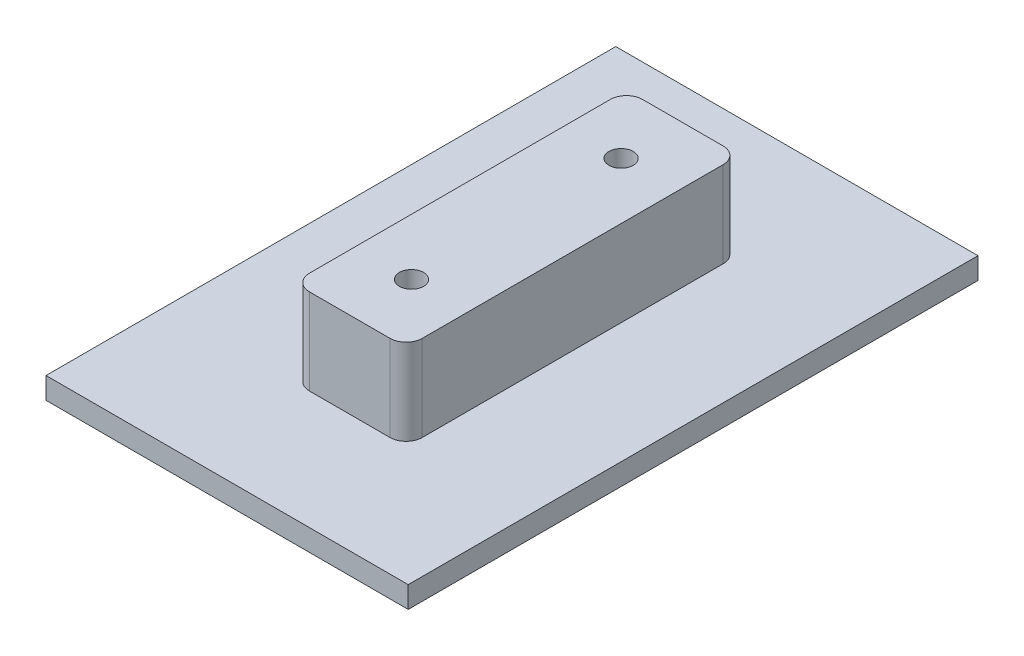
ISO-10303-21;
HEADER;
FILE_DESCRIPTION(('STEP AP214'),'2;1');
FILE_NAME('part.step','',(''),(''),'','','');
FILE_SCHEMA(('AUTOMOTIVE_DESIGN { 1 0 10303 214 1 1 1 1 }'));
ENDSEC;
DATA;
#1=APPLICATION_CONTEXT('core data for automotive mechanical design processes');
#2=APPLICATION_PROTOCOL_DEFINITION('international standard','automotive_design',2000,#1);
#3=PRODUCT_CONTEXT('',#1,'mechanical');
#4=PRODUCT('Part','Part','',(#3));
#5=PRODUCT_RELATED_PRODUCT_CATEGORY('part','',(#4));
#6=PRODUCT_DEFINITION_FORMATION('','',#4);
#7=PRODUCT_DEFINITION_CONTEXT('part definition',#1,'design');
#8=PRODUCT_DEFINITION('design','',#6,#7);
#9=PRODUCT_DEFINITION_SHAPE('','',#8);
#10=(LENGTH_UNIT() NAMED_UNIT(*) SI_UNIT(.MILLI.,.METRE.));
#11=(NAMED_UNIT(*) PLANE_ANGLE_UNIT() SI_UNIT($,.RADIAN.));
#12=(NAMED_UNIT(*) SI_UNIT($,.STERADIAN.) SOLID_ANGLE_UNIT());
#13=UNCERTAINTY_MEASURE_WITH_UNIT(LENGTH_MEASURE(1.E-05),#10,'distance_accuracy_value','');
#14=(GEOMETRIC_REPRESENTATION_CONTEXT(3) GLOBAL_UNCERTAINTY_ASSIGNED_CONTEXT((#13)) GLOBAL_UNIT_ASSIGNED_CONTEXT((#10,
#11,#12)) REPRESENTATION_CONTEXT('',''));
#15=CARTESIAN_POINT('',(0.,0.,0.));
#16=DIRECTION('',(0.,0.,1.));
#17=DIRECTION('',(1.,0.,0.));
#18=AXIS2_PLACEMENT_3D('',#15,#16,#17);
#19=CARTESIAN_POINT('',(-107.000738470902,0.,168.319923824924));
#20=DIRECTION('',(0.,1.,0.));
#21=DIRECTION('',(0.,0.,1.));
#22=AXIS2_PLACEMENT_3D('',#19,#20,#21);
#23=PLANE('',#22);
#24=DIRECTION('',(0.,0.,1.));
#25=VECTOR('',#24,1.);
#26=CARTESIAN_POINT('',(-107.000738470902,0.,-168.319923824925));
#27=LINE('',#26,#25);
#28=CARTESIAN_POINT('',(-107.000738470902,0.,-168.319923824925));
#29=VERTEX_POINT('',#28);
#30=CARTESIAN_POINT('',(-107.000738470902,0.,168.319923824924));
#31=VERTEX_POINT('',#30);
#32=EDGE_CURVE('E210',#29,#31,#27,.T.);
#33=ORIENTED_EDGE('',*,*,#32,.T.);
#34=DIRECTION('',(1.,0.,0.));
#35=VECTOR('',#34,1.);
#36=CARTESIAN_POINT('',(-107.000738470902,0.,168.319923824924));
#37=LINE('',#36,#35);
#38=CARTESIAN_POINT('',(107.000738470902,0.,168.319923824924));
#39=VERTEX_POINT('',#38);
#40=EDGE_CURVE('E225',#31,#39,#37,.T.);
#41=ORIENTED_EDGE('',*,*,#40,.T.);
#42=DIRECTION('',(0.,0.,-1.));
#43=VECTOR('',#42,1.);
#44=CARTESIAN_POINT('',(107.000738470901,0.,-168.319923824925));
#45=LINE('',#44,#43);
#46=CARTESIAN_POINT('',(107.000738470901,0.,-168.319923824925));
#47=VERTEX_POINT('',#46);
#48=EDGE_CURVE('E228',#39,#47,#45,.T.);
#49=ORIENTED_EDGE('',*,*,#48,.T.);
#50=DIRECTION('',(-1.,0.,0.));
#51=VECTOR('',#50,1.);
#52=CARTESIAN_POINT('',(-107.000738470902,0.,-168.319923824925));
#53=LINE('',#52,#51);
#54=EDGE_CURVE('E216',#47,#29,#53,.T.);
#55=ORIENTED_EDGE('',*,*,#54,.T.);
#56=EDGE_LOOP('',(#33,#41,#49,#55));
#57=FACE_BOUND('',#56,.T.);
#58=CARTESIAN_POINT('',(26.3482710557629,0.,88.9));
#59=DIRECTION('',(0.,1.,0.));
#60=DIRECTION('',(0.,0.,1.));
#61=AXIS2_PLACEMENT_3D('',#58,#59,#60);
#62=CIRCLE('',#61,9.52499999999999);
#63=CARTESIAN_POINT('',(26.3482710557629,0.,98.425));
#64=VERTEX_POINT('',#63);
#65=CARTESIAN_POINT('',(35.8732710557629,0.,88.9));
#66=VERTEX_POINT('',#65);
#67=EDGE_CURVE('E153',#64,#66,#62,.T.);
#68=ORIENTED_EDGE('',*,*,#67,.F.);
#69=DIRECTION('',(1.,0.,0.));
#70=VECTOR('',#69,1.);
#71=CARTESIAN_POINT('',(-21.2767289442371,0.,98.425));
#72=LINE('',#71,#70);
#73=CARTESIAN_POINT('',(-21.2767289442371,0.,98.425));
#74=VERTEX_POINT('',#73);
#75=EDGE_CURVE('E54',#74,#64,#72,.T.);
#76=ORIENTED_EDGE('',*,*,#75,.F.);
#77=CARTESIAN_POINT('',(-21.2767289442371,0.,88.9));
#78=DIRECTION('',(0.,1.,0.));
#79=DIRECTION('',(0.,0.,1.));
#80=AXIS2_PLACEMENT_3D('',#77,#78,#79);
#81=CIRCLE('',#80,9.525);
#82=CARTESIAN_POINT('',(-30.8017289442371,0.,88.9));
#83=VERTEX_POINT('',#82);
#84=EDGE_CURVE('E194',#83,#74,#81,.T.);
#85=ORIENTED_EDGE('',*,*,#84,.F.);
#86=DIRECTION('',(0.,0.,1.));
#87=VECTOR('',#86,1.);
#88=CARTESIAN_POINT('',(-30.8017289442371,0.,-88.9));
#89=LINE('',#88,#87);
#90=CARTESIAN_POINT('',(-30.8017289442371,0.,-88.9));
#91=VERTEX_POINT('',#90);
#92=EDGE_CURVE('E191',#91,#83,#89,.T.);
#93=ORIENTED_EDGE('',*,*,#92,.F.);
#94=CARTESIAN_POINT('',(-21.2767289442371,0.,-88.9));
#95=DIRECTION('',(0.,1.,0.));
#96=DIRECTION('',(0.,0.,1.));
#97=AXIS2_PLACEMENT_3D('',#94,#95,#96);
#98=CIRCLE('',#97,9.525);
#99=CARTESIAN_POINT('',(-21.2767289442371,0.,-98.425));
#100=VERTEX_POINT('',#99);
#101=EDGE_CURVE('E188',#100,#91,#98,.T.);
#102=ORIENTED_EDGE('',*,*,#101,.F.);
#103=DIRECTION('',(-1.,0.,0.));
#104=VECTOR('',#103,1.);
#105=CARTESIAN_POINT('',(26.3482710557629,0.,-98.425));
#106=LINE('',#105,#104);
#107=CARTESIAN_POINT('',(26.3482710557629,0.,-98.425));
#108=VERTEX_POINT('',#107);
#109=EDGE_CURVE('E185',#108,#100,#106,.T.);
#110=ORIENTED_EDGE('',*,*,#109,.F.);
#111=CARTESIAN_POINT('',(26.3482710557629,0.,-88.9));
#112=DIRECTION('',(0.,1.,0.));
#113=DIRECTION('',(0.,0.,1.));
#114=AXIS2_PLACEMENT_3D('',#111,#112,#113);
#115=CIRCLE('',#114,9.525);
#116=CARTESIAN_POINT('',(35.8732710557629,0.,-88.9));
#117=VERTEX_POINT('',#116);
#118=EDGE_CURVE('E182',#117,#108,#115,.T.);
#119=ORIENTED_EDGE('',*,*,#118,.F.);
#120=DIRECTION('',(0.,0.,-1.));
#121=VECTOR('',#120,1.);
#122=CARTESIAN_POINT('',(35.8732710557629,0.,88.9));
#123=LINE('',#122,#121);
#124=EDGE_CURVE('E179',#66,#117,#123,.T.);
#125=ORIENTED_EDGE('',*,*,#124,.F.);
#126=EDGE_LOOP('',(#68,#76,#85,#93,#102,#110,#119,#125));
#127=FACE_BOUND('',#126,.T.);
#128=ADVANCED_FACE('F39',(#57,#127),#23,.T.);
#129=CARTESIAN_POINT('',(-107.000738470902,-12.7,-168.319923824925));
#130=DIRECTION('',(-1.,0.,0.));
#131=DIRECTION('',(0.,0.,1.));
#132=AXIS2_PLACEMENT_3D('',#129,#130,#131);
#133=PLANE('',#132);
#134=ORIENTED_EDGE('',*,*,#32,.F.);
#135=DIRECTION('',(0.,1.,0.));
#136=VECTOR('',#135,1.);
#137=CARTESIAN_POINT('',(-107.000738470902,-12.7,-168.319923824925));
#138=LINE('',#137,#136);
#139=CARTESIAN_POINT('',(-107.000738470902,-12.7,-168.319923824925));
#140=VERTEX_POINT('',#139);
#141=EDGE_CURVE('E63',#140,#29,#138,.T.);
#142=ORIENTED_EDGE('',*,*,#141,.F.);
#143=DIRECTION('',(0.,0.,1.));
#144=VECTOR('',#143,1.);
#145=CARTESIAN_POINT('',(-107.000738470902,-12.7,-168.319923824925));
#146=LINE('',#145,#144);
#147=CARTESIAN_POINT('',(-107.000738470902,-12.7,168.319923824924));
#148=VERTEX_POINT('',#147);
#149=EDGE_CURVE('E213',#140,#148,#146,.T.);
#150=ORIENTED_EDGE('',*,*,#149,.T.);
#151=DIRECTION('',(0.,1.,0.));
#152=VECTOR('',#151,1.);
#153=CARTESIAN_POINT('',(-107.000738470902,-12.7,168.319923824924));
#154=LINE('',#153,#152);
#155=EDGE_CURVE('E89',#148,#31,#154,.T.);
#156=ORIENTED_EDGE('',*,*,#155,.T.);
#157=EDGE_LOOP('',(#134,#142,#150,#156));
#158=FACE_BOUND('',#157,.T.);
#159=ADVANCED_FACE('F41',(#158),#133,.T.);
#160=CARTESIAN_POINT('',(-107.000738470902,-12.7,-168.319923824925));
#161=DIRECTION('',(0.,0.,-1.));
#162=DIRECTION('',(-1.,0.,0.));
#163=AXIS2_PLACEMENT_3D('',#160,#161,#162);
#164=PLANE('',#163);
#165=ORIENTED_EDGE('',*,*,#54,.F.);
#166=DIRECTION('',(0.,1.,0.));
#167=VECTOR('',#166,1.);
#168=CARTESIAN_POINT('',(107.000738470901,-12.7,-168.319923824925));
#169=LINE('',#168,#167);
#170=CARTESIAN_POINT('',(107.000738470901,-12.7,-168.319923824925));
#171=VERTEX_POINT('',#170);
#172=EDGE_CURVE('E234',#171,#47,#169,.T.);
#173=ORIENTED_EDGE('',*,*,#172,.F.);
#174=DIRECTION('',(-1.,0.,0.));
#175=VECTOR('',#174,1.);
#176=CARTESIAN_POINT('',(-107.000738470902,-12.7,-168.319923824925));
#177=LINE('',#176,#175);
#178=EDGE_CURVE('E221',#171,#140,#177,.T.);
#179=ORIENTED_EDGE('',*,*,#178,.T.);
#180=ORIENTED_EDGE('',*,*,#141,.T.);
#181=EDGE_LOOP('',(#165,#173,#179,#180));
#182=FACE_BOUND('',#181,.T.);
#183=ADVANCED_FACE('F262',(#182),#164,.T.);
#184=CARTESIAN_POINT('',(107.000738470901,-12.7,-168.319923824925));
#185=DIRECTION('',(1.,0.,0.));
#186=DIRECTION('',(0.,0.,-1.));
#187=AXIS2_PLACEMENT_3D('',#184,#185,#186);
#188=PLANE('',#187);
#189=ORIENTED_EDGE('',*,*,#48,.F.);
#190=DIRECTION('',(0.,1.,0.));
#191=VECTOR('',#190,1.);
#192=CARTESIAN_POINT('',(107.000738470902,-12.7,168.319923824924));
#193=LINE('',#192,#191);
#194=CARTESIAN_POINT('',(107.000738470902,-12.7,168.319923824924));
#195=VERTEX_POINT('',#194);
#196=EDGE_CURVE('E236',#195,#39,#193,.T.);
#197=ORIENTED_EDGE('',*,*,#196,.F.);
#198=DIRECTION('',(0.,0.,-1.));
#199=VECTOR('',#198,1.);
#200=CARTESIAN_POINT('',(107.000738470901,-12.7,-168.319923824925));
#201=LINE('',#200,#199);
#202=EDGE_CURVE('E218',#195,#171,#201,.T.);
#203=ORIENTED_EDGE('',*,*,#202,.T.);
#204=ORIENTED_EDGE('',*,*,#172,.T.);
#205=EDGE_LOOP('',(#189,#197,#203,#204));
#206=FACE_BOUND('',#205,.T.);
#207=ADVANCED_FACE('F316',(#206),#188,.T.);
#208=CARTESIAN_POINT('',(-107.000738470902,-12.7,168.319923824924));
#209=DIRECTION('',(0.,0.,1.));
#210=DIRECTION('',(1.,0.,0.));
#211=AXIS2_PLACEMENT_3D('',#208,#209,#210);
#212=PLANE('',#211);
#213=ORIENTED_EDGE('',*,*,#40,.F.);
#214=ORIENTED_EDGE('',*,*,#155,.F.);
#215=DIRECTION('',(1.,0.,0.));
#216=VECTOR('',#215,1.);
#217=CARTESIAN_POINT('',(-107.000738470902,-12.7,168.319923824924));
#218=LINE('',#217,#216);
#219=EDGE_CURVE('E215',#148,#195,#218,.T.);
#220=ORIENTED_EDGE('',*,*,#219,.T.);
#221=ORIENTED_EDGE('',*,*,#196,.T.);
#222=EDGE_LOOP('',(#213,#214,#220,#221));
#223=FACE_BOUND('',#222,.T.);
#224=ADVANCED_FACE('F309',(#223),#212,.T.);
#225=CARTESIAN_POINT('',(-107.000738470902,-12.7,168.319923824924));
#226=DIRECTION('',(0.,1.,0.));
#227=DIRECTION('',(0.,0.,1.));
#228=AXIS2_PLACEMENT_3D('',#225,#226,#227);
#229=PLANE('',#228);
#230=ORIENTED_EDGE('',*,*,#149,.F.);
#231=ORIENTED_EDGE('',*,*,#178,.F.);
#232=ORIENTED_EDGE('',*,*,#202,.F.);
#233=ORIENTED_EDGE('',*,*,#219,.F.);
#234=EDGE_LOOP('',(#230,#231,#232,#233));
#235=FACE_BOUND('',#234,.T.);
#236=ADVANCED_FACE('F307',(#235),#229,.F.);
#237=CARTESIAN_POINT('',(2.53577105576288,258.58000530516,61.9125));
#238=DIRECTION('',(0.,-1.,0.));
#239=DIRECTION('',(0.,0.,-1.));
#240=AXIS2_PLACEMENT_3D('',#237,#238,#239);
#241=CYLINDRICAL_SURFACE('',#240,7.14375);
#242=CARTESIAN_POINT('',(2.53577105576288,0.,61.9125));
#243=DIRECTION('',(0.,1.,0.));
#244=DIRECTION('',(0.,0.,1.));
#245=AXIS2_PLACEMENT_3D('',#242,#243,#244);
#246=CIRCLE('',#245,7.14375);
#247=CARTESIAN_POINT('',(2.53577105576288,0.,69.05625));
#248=VERTEX_POINT('',#247);
#249=EDGE_CURVE('E11',#248,#248,#246,.F.);
#250=ORIENTED_EDGE('',*,*,#249,.T.);
#251=EDGE_LOOP('',(#250));
#252=FACE_BOUND('',#251,.T.);
#253=CARTESIAN_POINT('',(2.53577105576288,50.7447866221852,61.9125));
#254=DIRECTION('',(0.,1.,0.));
#255=DIRECTION('',(0.,0.,1.));
#256=AXIS2_PLACEMENT_3D('',#253,#254,#255);
#257=CIRCLE('',#256,7.14375);
#258=CARTESIAN_POINT('',(2.53577105576288,50.7447866221852,69.05625));
#259=VERTEX_POINT('',#258);
#260=EDGE_CURVE('E159',#259,#259,#257,.T.);
#261=ORIENTED_EDGE('',*,*,#260,.T.);
#262=EDGE_LOOP('',(#261));
#263=FACE_BOUND('',#262,.T.);
#264=ADVANCED_FACE('F294',(#252,#263),#241,.F.);
#265=CARTESIAN_POINT('',(-21.2767289442371,258.58000530516,98.425));
#266=DIRECTION('',(0.,0.,-1.));
#267=DIRECTION('',(-1.,0.,0.));
#268=AXIS2_PLACEMENT_3D('',#265,#266,#267);
#269=PLANE('',#268);
#270=DIRECTION('',(1.,0.,0.));
#271=VECTOR('',#270,1.);
#272=CARTESIAN_POINT('',(-21.2767289442371,50.7447866221852,98.425));
#273=LINE('',#272,#271);
#274=CARTESIAN_POINT('',(-21.2767289442371,50.7447866221852,98.425));
#275=VERTEX_POINT('',#274);
#276=CARTESIAN_POINT('',(26.3482710557629,50.7447866221852,98.425));
#277=VERTEX_POINT('',#276);
#278=EDGE_CURVE('E139',#275,#277,#273,.T.);
#279=ORIENTED_EDGE('',*,*,#278,.F.);
#280=DIRECTION('',(0.,-1.,0.));
#281=VECTOR('',#280,1.);
#282=CARTESIAN_POINT('',(-21.2767289442371,258.58000530516,98.425));
#283=LINE('',#282,#281);
#284=EDGE_CURVE('E144',#275,#74,#283,.T.);
#285=ORIENTED_EDGE('',*,*,#284,.T.);
#286=ORIENTED_EDGE('',*,*,#75,.T.);
#287=DIRECTION('',(0.,-1.,0.));
#288=VECTOR('',#287,1.);
#289=CARTESIAN_POINT('',(26.3482710557629,258.58000530516,98.425));
#290=LINE('',#289,#288);
#291=EDGE_CURVE('E135',#277,#64,#290,.T.);
#292=ORIENTED_EDGE('',*,*,#291,.F.);
#293=EDGE_LOOP('',(#279,#285,#286,#292));
#294=FACE_BOUND('',#293,.T.);
#295=ADVANCED_FACE('F137',(#294),#269,.F.);
#296=CARTESIAN_POINT('',(-21.2767289442371,258.58000530516,88.9));
#297=DIRECTION('',(0.,-1.,0.));
#298=DIRECTION('',(0.,0.,-1.));
#299=AXIS2_PLACEMENT_3D('',#296,#297,#298);
#300=CYLINDRICAL_SURFACE('',#299,9.525);
#301=CARTESIAN_POINT('',(-21.2767289442371,50.7447866221852,88.9));
#302=DIRECTION('',(0.,1.,0.));
#303=DIRECTION('',(0.,0.,1.));
#304=AXIS2_PLACEMENT_3D('',#301,#302,#303);
#305=CIRCLE('',#304,9.525);
#306=CARTESIAN_POINT('',(-30.8017289442371,50.7447866221852,88.9));
#307=VERTEX_POINT('',#306);
#308=EDGE_CURVE('E158',#307,#275,#305,.T.);
#309=ORIENTED_EDGE('',*,*,#308,.F.);
#310=DIRECTION('',(0.,-1.,0.));
#311=VECTOR('',#310,1.);
#312=CARTESIAN_POINT('',(-30.8017289442371,258.58000530516,88.9));
#313=LINE('',#312,#311);
#314=EDGE_CURVE('E199',#307,#83,#313,.T.);
#315=ORIENTED_EDGE('',*,*,#314,.T.);
#316=ORIENTED_EDGE('',*,*,#84,.T.);
#317=ORIENTED_EDGE('',*,*,#284,.F.);
#318=EDGE_LOOP('',(#309,#315,#316,#317));
#319=FACE_BOUND('',#318,.T.);
#320=ADVANCED_FACE('F286',(#319),#300,.T.);
#321=CARTESIAN_POINT('',(-30.8017289442371,258.58000530516,-88.9));
#322=DIRECTION('',(1.,0.,0.));
#323=DIRECTION('',(0.,0.,-1.));
#324=AXIS2_PLACEMENT_3D('',#321,#322,#323);
#325=PLANE('',#324);
#326=DIRECTION('',(0.,0.,1.));
#327=VECTOR('',#326,1.);
#328=CARTESIAN_POINT('',(-30.8017289442371,50.7447866221852,-88.9));
#329=LINE('',#328,#327);
#330=CARTESIAN_POINT('',(-30.8017289442371,50.7447866221852,-88.9));
#331=VERTEX_POINT('',#330);
#332=EDGE_CURVE('E161',#331,#307,#329,.T.);
#333=ORIENTED_EDGE('',*,*,#332,.F.);
#334=DIRECTION('',(0.,-1.,0.));
#335=VECTOR('',#334,1.);
#336=CARTESIAN_POINT('',(-30.8017289442371,258.58000530516,-88.9));
#337=LINE('',#336,#335);
#338=EDGE_CURVE('E201',#331,#91,#337,.T.);
#339=ORIENTED_EDGE('',*,*,#338,.T.);
#340=ORIENTED_EDGE('',*,*,#92,.T.);
#341=ORIENTED_EDGE('',*,*,#314,.F.);
#342=EDGE_LOOP('',(#333,#339,#340,#341));
#343=FACE_BOUND('',#342,.T.);
#344=ADVANCED_FACE('F284',(#343),#325,.F.);
#345=CARTESIAN_POINT('',(-21.2767289442371,258.58000530516,-88.9));
#346=DIRECTION('',(0.,-1.,0.));
#347=DIRECTION('',(0.,0.,-1.));
#348=AXIS2_PLACEMENT_3D('',#345,#346,#347);
#349=CYLINDRICAL_SURFACE('',#348,9.525);
#350=CARTESIAN_POINT('',(-21.2767289442371,50.7447866221852,-88.9));
#351=DIRECTION('',(0.,1.,0.));
#352=DIRECTION('',(0.,0.,1.));
#353=AXIS2_PLACEMENT_3D('',#350,#351,#352);
#354=CIRCLE('',#353,9.525);
#355=CARTESIAN_POINT('',(-21.2767289442371,50.7447866221852,-98.425));
#356=VERTEX_POINT('',#355);
#357=EDGE_CURVE('E168',#356,#331,#354,.T.);
#358=ORIENTED_EDGE('',*,*,#357,.F.);
#359=DIRECTION('',(0.,-1.,0.));
#360=VECTOR('',#359,1.);
#361=CARTESIAN_POINT('',(-21.2767289442371,258.58000530516,-98.425));
#362=LINE('',#361,#360);
#363=EDGE_CURVE('E203',#356,#100,#362,.T.);
#364=ORIENTED_EDGE('',*,*,#363,.T.);
#365=ORIENTED_EDGE('',*,*,#101,.T.);
#366=ORIENTED_EDGE('',*,*,#338,.F.);
#367=EDGE_LOOP('',(#358,#364,#365,#366));
#368=FACE_BOUND('',#367,.T.);
#369=ADVANCED_FACE('F279',(#368),#349,.T.);
#370=CARTESIAN_POINT('',(26.3482710557629,258.58000530516,-98.425));
#371=DIRECTION('',(0.,0.,1.));
#372=DIRECTION('',(1.,0.,0.));
#373=AXIS2_PLACEMENT_3D('',#370,#371,#372);
#374=PLANE('',#373);
#375=DIRECTION('',(-1.,0.,0.));
#376=VECTOR('',#375,1.);
#377=CARTESIAN_POINT('',(26.3482710557629,50.7447866221852,-98.425));
#378=LINE('',#377,#376);
#379=CARTESIAN_POINT('',(26.3482710557629,50.7447866221852,-98.425));
#380=VERTEX_POINT('',#379);
#381=EDGE_CURVE('E171',#380,#356,#378,.T.);
#382=ORIENTED_EDGE('',*,*,#381,.F.);
#383=DIRECTION('',(0.,-1.,0.));
#384=VECTOR('',#383,1.);
#385=CARTESIAN_POINT('',(26.3482710557629,258.58000530516,-98.425));
#386=LINE('',#385,#384);
#387=EDGE_CURVE('E205',#380,#108,#386,.T.);
#388=ORIENTED_EDGE('',*,*,#387,.T.);
#389=ORIENTED_EDGE('',*,*,#109,.T.);
#390=ORIENTED_EDGE('',*,*,#363,.F.);
#391=EDGE_LOOP('',(#382,#388,#389,#390));
#392=FACE_BOUND('',#391,.T.);
#393=ADVANCED_FACE('F275',(#392),#374,.F.);
#394=CARTESIAN_POINT('',(26.3482710557629,258.58000530516,-88.9));
#395=DIRECTION('',(0.,-1.,0.));
#396=DIRECTION('',(0.,0.,-1.));
#397=AXIS2_PLACEMENT_3D('',#394,#395,#396);
#398=CYLINDRICAL_SURFACE('',#397,9.525);
#399=CARTESIAN_POINT('',(26.3482710557629,50.7447866221852,-88.9));
#400=DIRECTION('',(0.,1.,0.));
#401=DIRECTION('',(0.,0.,1.));
#402=AXIS2_PLACEMENT_3D('',#399,#400,#401);
#403=CIRCLE('',#402,9.525);
#404=CARTESIAN_POINT('',(35.8732710557629,50.7447866221852,-88.9));
#405=VERTEX_POINT('',#404);
#406=EDGE_CURVE('E174',#405,#380,#403,.T.);
#407=ORIENTED_EDGE('',*,*,#406,.F.);
#408=DIRECTION('',(0.,-1.,0.));
#409=VECTOR('',#408,1.);
#410=CARTESIAN_POINT('',(35.8732710557629,258.58000530516,-88.9));
#411=LINE('',#410,#409);
#412=EDGE_CURVE('E207',#405,#117,#411,.T.);
#413=ORIENTED_EDGE('',*,*,#412,.T.);
#414=ORIENTED_EDGE('',*,*,#118,.T.);
#415=ORIENTED_EDGE('',*,*,#387,.F.);
#416=EDGE_LOOP('',(#407,#413,#414,#415));
#417=FACE_BOUND('',#416,.T.);
#418=ADVANCED_FACE('F273',(#417),#398,.T.);
#419=CARTESIAN_POINT('',(35.8732710557629,258.58000530516,88.9));
#420=DIRECTION('',(-1.,0.,0.));
#421=DIRECTION('',(0.,0.,1.));
#422=AXIS2_PLACEMENT_3D('',#419,#420,#421);
#423=PLANE('',#422);
#424=DIRECTION('',(0.,0.,-1.));
#425=VECTOR('',#424,1.);
#426=CARTESIAN_POINT('',(35.8732710557629,50.7447866221852,88.9));
#427=LINE('',#426,#425);
#428=CARTESIAN_POINT('',(35.8732710557629,50.7447866221852,88.9));
#429=VERTEX_POINT('',#428);
#430=EDGE_CURVE('E154',#429,#405,#427,.T.);
#431=ORIENTED_EDGE('',*,*,#430,.F.);
#432=DIRECTION('',(0.,-1.,0.));
#433=VECTOR('',#432,1.);
#434=CARTESIAN_POINT('',(35.8732710557629,258.58000530516,88.9));
#435=LINE('',#434,#433);
#436=EDGE_CURVE('E150',#429,#66,#435,.T.);
#437=ORIENTED_EDGE('',*,*,#436,.T.);
#438=ORIENTED_EDGE('',*,*,#124,.T.);
#439=ORIENTED_EDGE('',*,*,#412,.F.);
#440=EDGE_LOOP('',(#431,#437,#438,#439));
#441=FACE_BOUND('',#440,.T.);
#442=ADVANCED_FACE('F270',(#441),#423,.F.);
#443=CARTESIAN_POINT('',(26.3482710557629,258.58000530516,88.9));
#444=DIRECTION('',(0.,-1.,0.));
#445=DIRECTION('',(0.,0.,-1.));
#446=AXIS2_PLACEMENT_3D('',#443,#444,#445);
#447=CYLINDRICAL_SURFACE('',#446,9.52499999999999);
#448=CARTESIAN_POINT('',(26.3482710557629,50.7447866221852,88.9));
#449=DIRECTION('',(0.,1.,0.));
#450=DIRECTION('',(0.,0.,1.));
#451=AXIS2_PLACEMENT_3D('',#448,#449,#450);
#452=CIRCLE('',#451,9.52499999999999);
#453=EDGE_CURVE('E148',#277,#429,#452,.T.);
#454=ORIENTED_EDGE('',*,*,#453,.F.);
#455=ORIENTED_EDGE('',*,*,#291,.T.);
#456=ORIENTED_EDGE('',*,*,#67,.T.);
#457=ORIENTED_EDGE('',*,*,#436,.F.);
#458=EDGE_LOOP('',(#454,#455,#456,#457));
#459=FACE_BOUND('',#458,.T.);
#460=ADVANCED_FACE('F149',(#459),#447,.T.);
#461=CARTESIAN_POINT('',(2.53577105576288,258.58000530516,-61.9125));
#462=DIRECTION('',(0.,-1.,0.));
#463=DIRECTION('',(0.,0.,-1.));
#464=AXIS2_PLACEMENT_3D('',#461,#462,#463);
#465=CYLINDRICAL_SURFACE('',#464,7.14375);
#466=CARTESIAN_POINT('',(2.53577105576288,0.,-61.9125));
#467=DIRECTION('',(0.,1.,0.));
#468=DIRECTION('',(0.,0.,1.));
#469=AXIS2_PLACEMENT_3D('',#466,#467,#468);
#470=CIRCLE('',#469,7.14375);
#471=CARTESIAN_POINT('',(2.53577105576288,0.,-54.76875));
#472=VERTEX_POINT('',#471);
#473=EDGE_CURVE('E47',#472,#472,#470,.F.);
#474=ORIENTED_EDGE('',*,*,#473,.T.);
#475=EDGE_LOOP('',(#474));
#476=FACE_BOUND('',#475,.T.);
#477=CARTESIAN_POINT('',(2.53577105576288,50.7447866221852,-61.9125));
#478=DIRECTION('',(0.,1.,0.));
#479=DIRECTION('',(0.,0.,1.));
#480=AXIS2_PLACEMENT_3D('',#477,#478,#479);
#481=CIRCLE('',#480,7.14375);
#482=CARTESIAN_POINT('',(2.53577105576288,50.7447866221852,-54.76875));
#483=VERTEX_POINT('',#482);
#484=EDGE_CURVE('E164',#483,#483,#481,.T.);
#485=ORIENTED_EDGE('',*,*,#484,.T.);
#486=EDGE_LOOP('',(#485));
#487=FACE_BOUND('',#486,.T.);
#488=ADVANCED_FACE('F241',(#476,#487),#465,.F.);
#489=CARTESIAN_POINT('',(29.5232710557629,50.7447866221852,92.075));
#490=DIRECTION('',(0.,1.,0.));
#491=DIRECTION('',(0.,0.,1.));
#492=AXIS2_PLACEMENT_3D('',#489,#490,#491);
#493=PLANE('',#492);
#494=ORIENTED_EDGE('',*,*,#484,.F.);
#495=EDGE_LOOP('',(#494));
#496=FACE_BOUND('',#495,.T.);
#497=ORIENTED_EDGE('',*,*,#260,.F.);
#498=EDGE_LOOP('',(#497));
#499=FACE_BOUND('',#498,.T.);
#500=ORIENTED_EDGE('',*,*,#278,.T.);
#501=ORIENTED_EDGE('',*,*,#453,.T.);
#502=ORIENTED_EDGE('',*,*,#430,.T.);
#503=ORIENTED_EDGE('',*,*,#406,.T.);
#504=ORIENTED_EDGE('',*,*,#381,.T.);
#505=ORIENTED_EDGE('',*,*,#357,.T.);
#506=ORIENTED_EDGE('',*,*,#332,.T.);
#507=ORIENTED_EDGE('',*,*,#308,.T.);
#508=EDGE_LOOP('',(#500,#501,#502,#503,#504,#505,#506,#507));
#509=FACE_BOUND('',#508,.T.);
#510=ADVANCED_FACE('F156',(#496,#499,#509),#493,.T.);
#511=ORIENTED_EDGE('',*,*,#473,.F.);
#512=EDGE_LOOP('',(#511));
#513=FACE_BOUND('',#512,.T.);
#514=ADVANCED_FACE('F244',(#513),#23,.T.);
#515=ORIENTED_EDGE('',*,*,#249,.F.);
#516=EDGE_LOOP('',(#515));
#517=FACE_BOUND('',#516,.T.);
#518=ADVANCED_FACE('F246',(#517),#23,.T.);
#519=CLOSED_SHELL('',(#128,#159,#183,#207,#224,#236,#264,#295,#320,#344,#369,#393,#418,#442,
#460,#488,#510,#514,#518));
#520=MANIFOLD_SOLID_BREP('B2',#519);
#521=ADVANCED_BREP_SHAPE_REPRESENTATION('',(#18,#520),#14);
#522=SHAPE_DEFINITION_REPRESENTATION(#9,#521);
ENDSEC;
END-ISO-10303-21;
